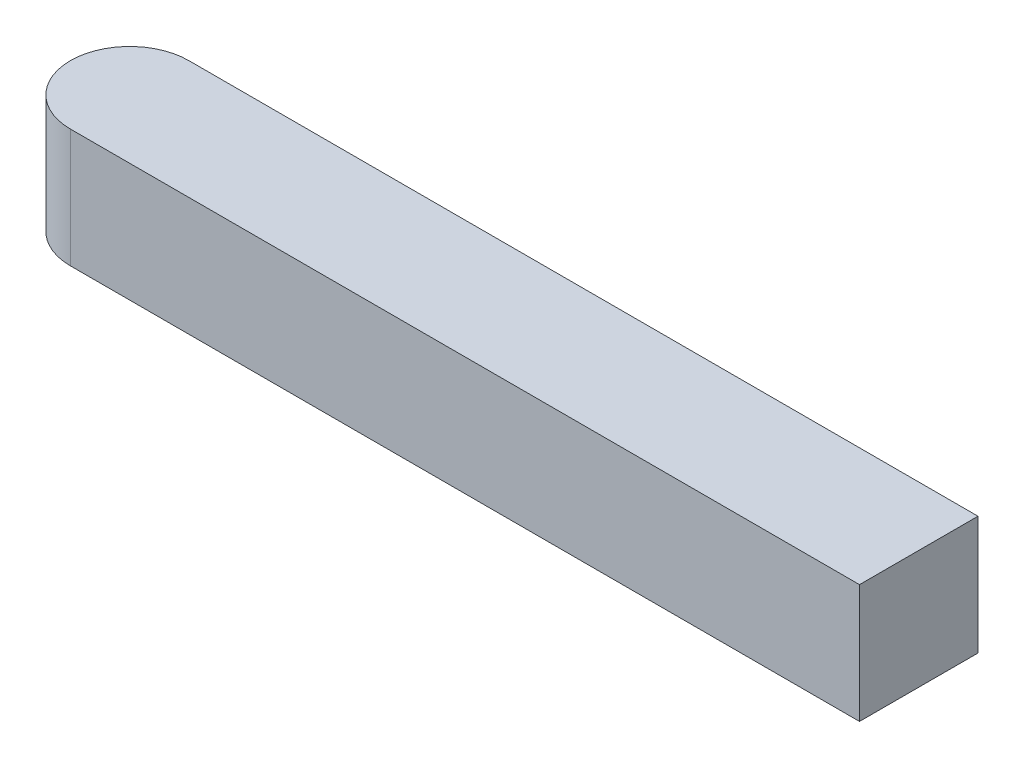
ISO-10303-21;
HEADER;
FILE_DESCRIPTION(('STEP AP214'),'2;1');
FILE_NAME('part.step','',(''),(''),'','','');
FILE_SCHEMA(('AUTOMOTIVE_DESIGN { 1 0 10303 214 1 1 1 1 }'));
ENDSEC;
DATA;
#1=APPLICATION_CONTEXT('core data for automotive mechanical design processes');
#2=APPLICATION_PROTOCOL_DEFINITION('international standard','automotive_design',2000,#1);
#3=PRODUCT_CONTEXT('',#1,'mechanical');
#4=PRODUCT('Part','Part','',(#3));
#5=PRODUCT_RELATED_PRODUCT_CATEGORY('part','',(#4));
#6=PRODUCT_DEFINITION_FORMATION('','',#4);
#7=PRODUCT_DEFINITION_CONTEXT('part definition',#1,'design');
#8=PRODUCT_DEFINITION('design','',#6,#7);
#9=PRODUCT_DEFINITION_SHAPE('','',#8);
#10=(LENGTH_UNIT() NAMED_UNIT(*) SI_UNIT(.MILLI.,.METRE.));
#11=(NAMED_UNIT(*) PLANE_ANGLE_UNIT() SI_UNIT($,.RADIAN.));
#12=(NAMED_UNIT(*) SI_UNIT($,.STERADIAN.) SOLID_ANGLE_UNIT());
#13=UNCERTAINTY_MEASURE_WITH_UNIT(LENGTH_MEASURE(1.E-05),#10,'distance_accuracy_value','');
#14=(GEOMETRIC_REPRESENTATION_CONTEXT(3) GLOBAL_UNCERTAINTY_ASSIGNED_CONTEXT((#13)) GLOBAL_UNIT_ASSIGNED_CONTEXT((#10,
#11,#12)) REPRESENTATION_CONTEXT('',''));
#15=CARTESIAN_POINT('',(0.,0.,0.));
#16=DIRECTION('',(0.,0.,1.));
#17=DIRECTION('',(1.,0.,0.));
#18=AXIS2_PLACEMENT_3D('',#15,#16,#17);
#19=CARTESIAN_POINT('',(-31.7185,0.,-2.3815));
#20=DIRECTION('',(0.,0.,-1.));
#21=DIRECTION('',(0.,1.,0.));
#22=AXIS2_PLACEMENT_3D('',#19,#20,#21);
#23=PLANE('',#22);
#24=DIRECTION('',(-1.,0.,0.));
#25=VECTOR('',#24,1.);
#26=CARTESIAN_POINT('',(0.,0.,-2.3815));
#27=LINE('',#26,#25);
#28=CARTESIAN_POINT('',(0.,0.,-2.3815));
#29=VERTEX_POINT('',#28);
#30=CARTESIAN_POINT('',(-31.7185,0.,-2.3815));
#31=VERTEX_POINT('',#30);
#32=EDGE_CURVE('E57',#29,#31,#27,.T.);
#33=ORIENTED_EDGE('',*,*,#32,.T.);
#34=DIRECTION('',(0.,1.,0.));
#35=VECTOR('',#34,1.);
#36=CARTESIAN_POINT('',(-31.7185,0.,-2.3815));
#37=LINE('',#36,#35);
#38=CARTESIAN_POINT('',(-31.7185,4.763,-2.3815));
#39=VERTEX_POINT('',#38);
#40=EDGE_CURVE('E70',#39,#31,#37,.F.);
#41=ORIENTED_EDGE('',*,*,#40,.F.);
#42=DIRECTION('',(1.,0.,0.));
#43=VECTOR('',#42,1.);
#44=CARTESIAN_POINT('',(-31.7185,4.763,-2.3815));
#45=LINE('',#44,#43);
#46=CARTESIAN_POINT('',(0.,4.763,-2.3815));
#47=VERTEX_POINT('',#46);
#48=EDGE_CURVE('E76',#47,#39,#45,.F.);
#49=ORIENTED_EDGE('',*,*,#48,.F.);
#50=DIRECTION('',(0.,-1.,0.));
#51=VECTOR('',#50,1.);
#52=CARTESIAN_POINT('',(0.,4.763,-2.3815));
#53=LINE('',#52,#51);
#54=EDGE_CURVE('E64',#47,#29,#53,.T.);
#55=ORIENTED_EDGE('',*,*,#54,.T.);
#56=EDGE_LOOP('',(#33,#41,#49,#55));
#57=FACE_BOUND('',#56,.T.);
#58=ADVANCED_FACE('F17',(#57),#23,.T.);
#59=CARTESIAN_POINT('',(-31.7185,4.763,0.));
#60=DIRECTION('',(0.,-1.,0.));
#61=DIRECTION('',(0.,0.,1.));
#62=AXIS2_PLACEMENT_3D('',#59,#60,#61);
#63=CYLINDRICAL_SURFACE('',#62,2.3815);
#64=CARTESIAN_POINT('',(-31.7185,0.,0.));
#65=DIRECTION('',(0.,1.,0.));
#66=DIRECTION('',(0.,0.,-1.));
#67=AXIS2_PLACEMENT_3D('',#64,#65,#66);
#68=CIRCLE('',#67,2.3815);
#69=CARTESIAN_POINT('',(-31.7185,0.,2.3815));
#70=VERTEX_POINT('',#69);
#71=EDGE_CURVE('E55',#31,#70,#68,.T.);
#72=ORIENTED_EDGE('',*,*,#71,.T.);
#73=DIRECTION('',(0.,1.,0.));
#74=VECTOR('',#73,1.);
#75=CARTESIAN_POINT('',(-31.7185,0.,2.3815));
#76=LINE('',#75,#74);
#77=CARTESIAN_POINT('',(-31.7185,4.763,2.3815));
#78=VERTEX_POINT('',#77);
#79=EDGE_CURVE('E63',#78,#70,#76,.F.);
#80=ORIENTED_EDGE('',*,*,#79,.F.);
#81=CARTESIAN_POINT('',(-31.7185,4.763,0.));
#82=DIRECTION('',(0.,-1.,0.));
#83=DIRECTION('',(0.,0.,1.));
#84=AXIS2_PLACEMENT_3D('',#81,#82,#83);
#85=CIRCLE('',#84,2.3815);
#86=EDGE_CURVE('E75',#39,#78,#85,.F.);
#87=ORIENTED_EDGE('',*,*,#86,.F.);
#88=ORIENTED_EDGE('',*,*,#40,.T.);
#89=EDGE_LOOP('',(#72,#80,#87,#88));
#90=FACE_BOUND('',#89,.T.);
#91=ADVANCED_FACE('F74',(#90),#63,.T.);
#92=CARTESIAN_POINT('',(0.,0.,2.3815));
#93=DIRECTION('',(0.,0.,1.));
#94=DIRECTION('',(0.,1.,0.));
#95=AXIS2_PLACEMENT_3D('',#92,#93,#94);
#96=PLANE('',#95);
#97=DIRECTION('',(1.,0.,0.));
#98=VECTOR('',#97,1.);
#99=CARTESIAN_POINT('',(-31.7185,0.,2.3815));
#100=LINE('',#99,#98);
#101=CARTESIAN_POINT('',(0.,0.,2.3815));
#102=VERTEX_POINT('',#101);
#103=EDGE_CURVE('E58',#70,#102,#100,.T.);
#104=ORIENTED_EDGE('',*,*,#103,.T.);
#105=DIRECTION('',(0.,1.,0.));
#106=VECTOR('',#105,1.);
#107=CARTESIAN_POINT('',(0.,0.,2.3815));
#108=LINE('',#107,#106);
#109=CARTESIAN_POINT('',(0.,4.763,2.3815));
#110=VERTEX_POINT('',#109);
#111=EDGE_CURVE('E98',#110,#102,#108,.F.);
#112=ORIENTED_EDGE('',*,*,#111,.F.);
#113=DIRECTION('',(-1.,0.,0.));
#114=VECTOR('',#113,1.);
#115=CARTESIAN_POINT('',(0.,4.763,2.3815));
#116=LINE('',#115,#114);
#117=EDGE_CURVE('E32',#78,#110,#116,.F.);
#118=ORIENTED_EDGE('',*,*,#117,.F.);
#119=ORIENTED_EDGE('',*,*,#79,.T.);
#120=EDGE_LOOP('',(#104,#112,#118,#119));
#121=FACE_BOUND('',#120,.T.);
#122=ADVANCED_FACE('F114',(#121),#96,.T.);
#123=CARTESIAN_POINT('',(0.,0.,-2.3815));
#124=DIRECTION('',(1.,0.,0.));
#125=DIRECTION('',(0.,1.,0.));
#126=AXIS2_PLACEMENT_3D('',#123,#124,#125);
#127=PLANE('',#126);
#128=DIRECTION('',(0.,0.,-1.));
#129=VECTOR('',#128,1.);
#130=CARTESIAN_POINT('',(0.,0.,2.3815));
#131=LINE('',#130,#129);
#132=EDGE_CURVE('E26',#102,#29,#131,.T.);
#133=ORIENTED_EDGE('',*,*,#132,.T.);
#134=ORIENTED_EDGE('',*,*,#54,.F.);
#135=DIRECTION('',(0.,0.,1.));
#136=VECTOR('',#135,1.);
#137=CARTESIAN_POINT('',(0.,4.763,-2.3815));
#138=LINE('',#137,#136);
#139=EDGE_CURVE('E11',#110,#47,#138,.F.);
#140=ORIENTED_EDGE('',*,*,#139,.F.);
#141=ORIENTED_EDGE('',*,*,#111,.T.);
#142=EDGE_LOOP('',(#133,#134,#140,#141));
#143=FACE_BOUND('',#142,.T.);
#144=ADVANCED_FACE('F111',(#143),#127,.T.);
#145=CARTESIAN_POINT('',(-34.3325084002014,4.763,-2.3815));
#146=DIRECTION('',(0.,1.,0.));
#147=DIRECTION('',(0.,0.,1.));
#148=AXIS2_PLACEMENT_3D('',#145,#146,#147);
#149=PLANE('',#148);
#150=ORIENTED_EDGE('',*,*,#48,.T.);
#151=ORIENTED_EDGE('',*,*,#86,.T.);
#152=ORIENTED_EDGE('',*,*,#117,.T.);
#153=ORIENTED_EDGE('',*,*,#139,.T.);
#154=EDGE_LOOP('',(#150,#151,#152,#153));
#155=FACE_BOUND('',#154,.T.);
#156=ADVANCED_FACE('F122',(#155),#149,.T.);
#157=CARTESIAN_POINT('',(-34.3325084002014,0.,-2.3815));
#158=DIRECTION('',(0.,-1.,0.));
#159=DIRECTION('',(1.,0.,0.));
#160=AXIS2_PLACEMENT_3D('',#157,#158,#159);
#161=PLANE('',#160);
#162=ORIENTED_EDGE('',*,*,#32,.F.);
#163=ORIENTED_EDGE('',*,*,#132,.F.);
#164=ORIENTED_EDGE('',*,*,#103,.F.);
#165=ORIENTED_EDGE('',*,*,#71,.F.);
#166=EDGE_LOOP('',(#162,#163,#164,#165));
#167=FACE_BOUND('',#166,.T.);
#168=ADVANCED_FACE('F19',(#167),#161,.T.);
#169=CLOSED_SHELL('',(#58,#91,#122,#144,#156,#168));
#170=MANIFOLD_SOLID_BREP('B1',#169);
#171=ADVANCED_BREP_SHAPE_REPRESENTATION('',(#18,#170),#14);
#172=SHAPE_DEFINITION_REPRESENTATION(#9,#171);
ENDSEC;
END-ISO-10303-21;
